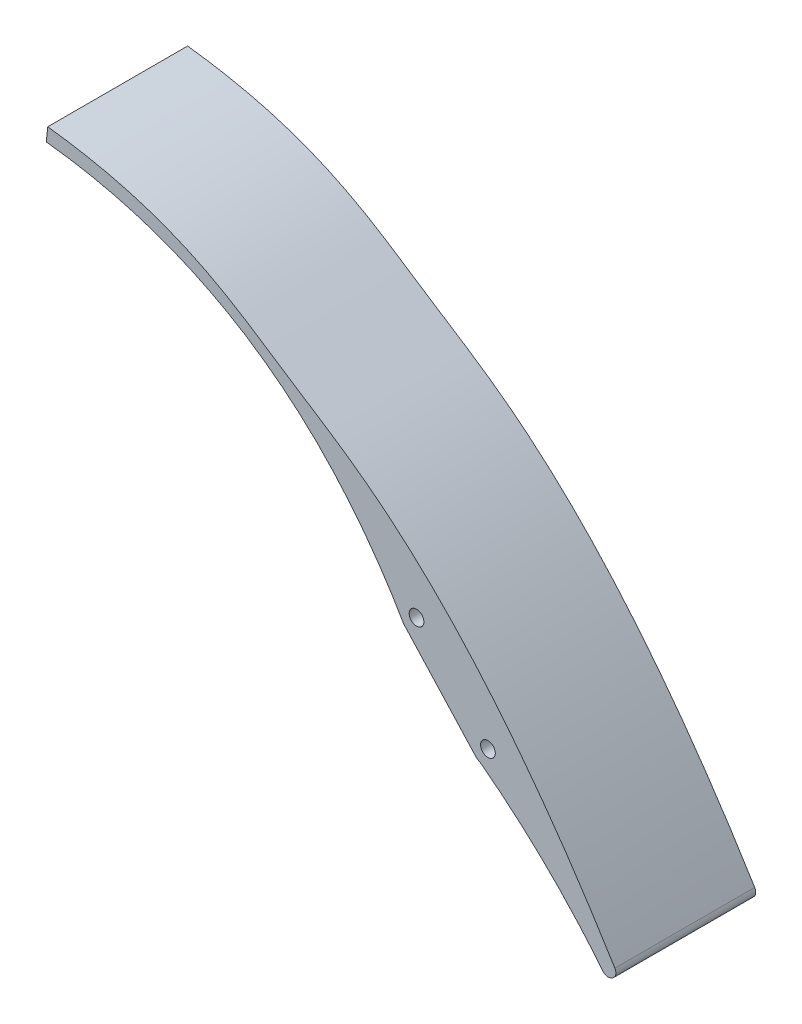
ISO-10303-21;
HEADER;
FILE_DESCRIPTION(('STEP AP214'),'2;1');
FILE_NAME('part.step','',(''),(''),'','','');
FILE_SCHEMA(('AUTOMOTIVE_DESIGN { 1 0 10303 214 1 1 1 1 }'));
ENDSEC;
DATA;
#1=APPLICATION_CONTEXT('core data for automotive mechanical design processes');
#2=APPLICATION_PROTOCOL_DEFINITION('international standard','automotive_design',2000,#1);
#3=PRODUCT_CONTEXT('',#1,'mechanical');
#4=PRODUCT('Part','Part','',(#3));
#5=PRODUCT_RELATED_PRODUCT_CATEGORY('part','',(#4));
#6=PRODUCT_DEFINITION_FORMATION('','',#4);
#7=PRODUCT_DEFINITION_CONTEXT('part definition',#1,'design');
#8=PRODUCT_DEFINITION('design','',#6,#7);
#9=PRODUCT_DEFINITION_SHAPE('','',#8);
#10=(LENGTH_UNIT() NAMED_UNIT(*) SI_UNIT(.MILLI.,.METRE.));
#11=(NAMED_UNIT(*) PLANE_ANGLE_UNIT() SI_UNIT($,.RADIAN.));
#12=(NAMED_UNIT(*) SI_UNIT($,.STERADIAN.) SOLID_ANGLE_UNIT());
#13=UNCERTAINTY_MEASURE_WITH_UNIT(LENGTH_MEASURE(1.E-05),#10,'distance_accuracy_value','');
#14=(GEOMETRIC_REPRESENTATION_CONTEXT(3) GLOBAL_UNCERTAINTY_ASSIGNED_CONTEXT((#13)) GLOBAL_UNIT_ASSIGNED_CONTEXT((#10,
#11,#12)) REPRESENTATION_CONTEXT('',''));
#15=CARTESIAN_POINT('',(0.,0.,0.));
#16=DIRECTION('',(0.,0.,1.));
#17=DIRECTION('',(1.,0.,0.));
#18=AXIS2_PLACEMENT_3D('',#15,#16,#17);
#19=CARTESIAN_POINT('',(130.724364715607,-46.4528662024338,40.));
#20=DIRECTION('',(0.,0.,-1.));
#21=DIRECTION('',(-1.,0.,0.));
#22=AXIS2_PLACEMENT_3D('',#19,#20,#21);
#23=CYLINDRICAL_SURFACE('',#22,1.70000000000007);
#24=CARTESIAN_POINT('',(130.724364715607,-46.4528662024338,34.3));
#25=DIRECTION('',(0.,0.,1.));
#26=DIRECTION('',(1.,0.,0.));
#27=AXIS2_PLACEMENT_3D('',#24,#25,#26);
#28=CIRCLE('',#27,1.70000000000007);
#29=CARTESIAN_POINT('',(132.424364715607,-46.4528662024338,34.3));
#30=VERTEX_POINT('',#29);
#31=EDGE_CURVE('E157',#30,#30,#28,.T.);
#32=ORIENTED_EDGE('',*,*,#31,.T.);
#33=EDGE_LOOP('',(#32));
#34=FACE_BOUND('',#33,.T.);
#35=CARTESIAN_POINT('',(130.724364715607,-46.4528662024338,5.7));
#36=DIRECTION('',(0.,0.,-1.));
#37=DIRECTION('',(-1.,0.,0.));
#38=AXIS2_PLACEMENT_3D('',#35,#36,#37);
#39=CIRCLE('',#38,1.70000000000007);
#40=CARTESIAN_POINT('',(129.024364715607,-46.4528662024338,5.7));
#41=VERTEX_POINT('',#40);
#42=EDGE_CURVE('E45',#41,#41,#39,.T.);
#43=ORIENTED_EDGE('',*,*,#42,.T.);
#44=EDGE_LOOP('',(#43));
#45=FACE_BOUND('',#44,.T.);
#46=ADVANCED_FACE('F41',(#34,#45),#23,.F.);
#47=CARTESIAN_POINT('',(110.297796690224,-24.1245872252414,40.));
#48=DIRECTION('',(0.,0.,-1.));
#49=DIRECTION('',(-1.,0.,0.));
#50=AXIS2_PLACEMENT_3D('',#47,#48,#49);
#51=CYLINDRICAL_SURFACE('',#50,1.7);
#52=CARTESIAN_POINT('',(110.297796690224,-24.1245872252414,34.3));
#53=DIRECTION('',(0.,0.,1.));
#54=DIRECTION('',(1.,0.,0.));
#55=AXIS2_PLACEMENT_3D('',#52,#53,#54);
#56=CIRCLE('',#55,1.7);
#57=CARTESIAN_POINT('',(111.997796690224,-24.1245872252414,34.3));
#58=VERTEX_POINT('',#57);
#59=EDGE_CURVE('E154',#58,#58,#56,.T.);
#60=ORIENTED_EDGE('',*,*,#59,.T.);
#61=EDGE_LOOP('',(#60));
#62=FACE_BOUND('',#61,.T.);
#63=CARTESIAN_POINT('',(110.297796690224,-24.1245872252414,5.7));
#64=DIRECTION('',(0.,0.,-1.));
#65=DIRECTION('',(-1.,0.,0.));
#66=AXIS2_PLACEMENT_3D('',#63,#64,#65);
#67=CIRCLE('',#66,1.7);
#68=CARTESIAN_POINT('',(108.597796690224,-24.1245872252414,5.7));
#69=VERTEX_POINT('',#68);
#70=EDGE_CURVE('E160',#69,#69,#67,.T.);
#71=ORIENTED_EDGE('',*,*,#70,.T.);
#72=EDGE_LOOP('',(#71));
#73=FACE_BOUND('',#72,.T.);
#74=ADVANCED_FACE('F217',(#62,#73),#51,.F.);
#75=CARTESIAN_POINT('',(70.6758975324158,19.0548698246532,40.));
#76=DIRECTION('',(0.,0.,1.));
#77=DIRECTION('',(1.,0.,0.));
#78=AXIS2_PLACEMENT_3D('',#75,#76,#77);
#79=PLANE('',#78);
#80=CARTESIAN_POINT('',(110.297796690224,-24.1245872252414,40.));
#81=DIRECTION('',(0.,0.,1.));
#82=DIRECTION('',(1.,0.,0.));
#83=AXIS2_PLACEMENT_3D('',#80,#81,#82);
#84=CIRCLE('',#83,2.1);
#85=CARTESIAN_POINT('',(112.397796690224,-24.1245872252414,40.));
#86=VERTEX_POINT('',#85);
#87=EDGE_CURVE('E183',#86,#86,#84,.T.);
#88=ORIENTED_EDGE('',*,*,#87,.F.);
#89=EDGE_LOOP('',(#88));
#90=FACE_BOUND('',#89,.T.);
#91=CARTESIAN_POINT('',(130.724364715607,-46.4528662024338,40.));
#92=DIRECTION('',(0.,0.,1.));
#93=DIRECTION('',(1.,0.,0.));
#94=AXIS2_PLACEMENT_3D('',#91,#92,#93);
#95=CIRCLE('',#94,2.09999999999999);
#96=CARTESIAN_POINT('',(132.824364715607,-46.4528662024338,40.));
#97=VERTEX_POINT('',#96);
#98=EDGE_CURVE('E186',#97,#97,#95,.T.);
#99=ORIENTED_EDGE('',*,*,#98,.F.);
#100=EDGE_LOOP('',(#99));
#101=FACE_BOUND('',#100,.T.);
#102=CARTESIAN_POINT('',(128.743429567469,-51.0437153547012,40.));
#103=CARTESIAN_POINT('',(148.96843839334,-66.4337260488509,40.));
#104=CARTESIAN_POINT('',(164.635114100417,-86.3416627578946,40.));
#105=B_SPLINE_CURVE_WITH_KNOTS('',2,(#102,#103,#104),.UNSPECIFIED.,.F.,.F.,(3,3),(0.,1.),.UNSPECIFIED.);
#106=CARTESIAN_POINT('',(128.743429567469,-51.0437153547012,40.));
#107=VERTEX_POINT('',#106);
#108=CARTESIAN_POINT('',(163.560215272833,-84.9877828397496,40.));
#109=VERTEX_POINT('',#108);
#110=EDGE_CURVE('E240',#107,#109,#105,.T.);
#111=ORIENTED_EDGE('',*,*,#110,.T.);
#112=CARTESIAN_POINT('',(165.121208388349,-83.7374626834253,40.));
#113=DIRECTION('',(0.,0.,1.));
#114=DIRECTION('',(1.,0.,0.));
#115=AXIS2_PLACEMENT_3D('',#112,#113,#114);
#116=CIRCLE('',#115,2.);
#117=CARTESIAN_POINT('',(166.133452705259,-85.4623862883665,40.));
#118=VERTEX_POINT('',#117);
#119=EDGE_CURVE('E50',#109,#118,#116,.T.);
#120=ORIENTED_EDGE('',*,*,#119,.T.);
#121=DIRECTION('',(0.862461802470616,0.506122158454989,0.));
#122=VECTOR('',#121,1.);
#123=CARTESIAN_POINT('',(164.635114100417,-86.3416627578946,40.));
#124=LINE('',#123,#122);
#125=CARTESIAN_POINT('',(166.331834159062,-85.3459692490161,40.));
#126=VERTEX_POINT('',#125);
#127=EDGE_CURVE('E246',#118,#126,#124,.T.);
#128=ORIENTED_EDGE('',*,*,#127,.T.);
#129=CARTESIAN_POINT('',(165.319589842152,-83.6210456440749,40.));
#130=DIRECTION('',(0.,0.,1.));
#131=DIRECTION('',(1.,0.,0.));
#132=AXIS2_PLACEMENT_3D('',#129,#130,#131);
#133=CIRCLE('',#132,2.);
#134=CARTESIAN_POINT('',(167.026129233461,-82.5781059018509,40.));
#135=VERTEX_POINT('',#134);
#136=EDGE_CURVE('E58',#126,#135,#133,.T.);
#137=ORIENTED_EDGE('',*,*,#136,.T.);
#138=CARTESIAN_POINT('',(168.084692517356,-84.3173318609907,40.));
#139=CARTESIAN_POINT('',(129.85642190733,-21.2507757173742,40.));
#140=CARTESIAN_POINT('',(92.1542600001913,5.4064902077778,40.));
#141=CARTESIAN_POINT('',(60.0163151433192,25.5499092680861,40.));
#142=CARTESIAN_POINT('',(41.684065008171,40.2044709795662,40.));
#143=CARTESIAN_POINT('',(4.82315625797057,44.7407774151411,40.));
#144=B_SPLINE_CURVE_WITH_KNOTS('',3,(#138,#139,#140,#141,#142,#143),.UNSPECIFIED.,.F.,.F.,(4,1,
1,4),(0.,0.363944680239571,0.463944680239571,1.),.UNSPECIFIED.);
#145=CARTESIAN_POINT('',(4.82315625797057,44.7407774151411,40.));
#146=VERTEX_POINT('',#145);
#147=EDGE_CURVE('E114',#135,#146,#144,.T.);
#148=ORIENTED_EDGE('',*,*,#147,.T.);
#149=DIRECTION('',(-0.107181250177124,-0.994239498114247,0.));
#150=VECTOR('',#149,1.);
#151=CARTESIAN_POINT('',(4.82315625797057,44.7407774151411,40.));
#152=LINE('',#151,#150);
#153=CARTESIAN_POINT('',(4.39443125726207,40.7638194226841,40.));
#154=VERTEX_POINT('',#153);
#155=EDGE_CURVE('E117',#146,#154,#152,.T.);
#156=ORIENTED_EDGE('',*,*,#155,.T.);
#157=CARTESIAN_POINT('',(4.39443125726207,40.7638194226841,40.));
#158=CARTESIAN_POINT('',(71.4407283146677,33.3323945022629,40.));
#159=CARTESIAN_POINT('',(106.608651808152,-27.4995257489901,40.));
#160=B_SPLINE_CURVE_WITH_KNOTS('',2,(#157,#158,#159),.UNSPECIFIED.,.F.,.F.,(3,3),(0.,1.),.UNSPECIFIED.);
#161=CARTESIAN_POINT('',(106.608651808152,-27.4995257489901,40.));
#162=VERTEX_POINT('',#161);
#163=EDGE_CURVE('E131',#154,#162,#160,.T.);
#164=ORIENTED_EDGE('',*,*,#163,.T.);
#165=DIRECTION('',(0.674987704749734,-0.737828976414376,0.));
#166=VECTOR('',#165,1.);
#167=CARTESIAN_POINT('',(106.608651808152,-27.4995257489901,40.));
#168=LINE('',#167,#166);
#169=CARTESIAN_POINT('',(127.035219833535,-49.8278047261825,40.));
#170=VERTEX_POINT('',#169);
#171=EDGE_CURVE('E293',#162,#170,#168,.T.);
#172=ORIENTED_EDGE('',*,*,#171,.T.);
#173=CARTESIAN_POINT('',(130.724364715607,-46.4528662024338,40.));
#174=DIRECTION('',(0.,0.,1.));
#175=DIRECTION('',(1.,0.,0.));
#176=AXIS2_PLACEMENT_3D('',#173,#174,#175);
#177=CIRCLE('',#176,5.00000000000002);
#178=EDGE_CURVE('E247',#170,#107,#177,.T.);
#179=ORIENTED_EDGE('',*,*,#178,.T.);
#180=EDGE_LOOP('',(#111,#120,#128,#137,#148,#156,#164,#172,#179));
#181=FACE_BOUND('',#180,.T.);
#182=ADVANCED_FACE('F116',(#90,#101,#181),#79,.T.);
#183=CARTESIAN_POINT('',(70.6758975324158,19.0548698246532,0.));
#184=DIRECTION('',(0.,0.,1.));
#185=DIRECTION('',(1.,0.,0.));
#186=AXIS2_PLACEMENT_3D('',#183,#184,#185);
#187=PLANE('',#186);
#188=CARTESIAN_POINT('',(110.297796690224,-24.1245872252414,0.));
#189=DIRECTION('',(0.,0.,1.));
#190=DIRECTION('',(1.,0.,0.));
#191=AXIS2_PLACEMENT_3D('',#188,#189,#190);
#192=CIRCLE('',#191,2.1);
#193=CARTESIAN_POINT('',(112.397796690224,-24.1245872252414,0.));
#194=VERTEX_POINT('',#193);
#195=EDGE_CURVE('E168',#194,#194,#192,.T.);
#196=ORIENTED_EDGE('',*,*,#195,.T.);
#197=EDGE_LOOP('',(#196));
#198=FACE_BOUND('',#197,.T.);
#199=CARTESIAN_POINT('',(130.724364715607,-46.4528662024338,0.));
#200=DIRECTION('',(0.,0.,1.));
#201=DIRECTION('',(1.,0.,0.));
#202=AXIS2_PLACEMENT_3D('',#199,#200,#201);
#203=CIRCLE('',#202,2.09999999999999);
#204=CARTESIAN_POINT('',(132.824364715607,-46.4528662024338,0.));
#205=VERTEX_POINT('',#204);
#206=EDGE_CURVE('E178',#205,#205,#203,.T.);
#207=ORIENTED_EDGE('',*,*,#206,.T.);
#208=EDGE_LOOP('',(#207));
#209=FACE_BOUND('',#208,.T.);
#210=DIRECTION('',(0.862461802470616,0.506122158454989,0.));
#211=VECTOR('',#210,1.);
#212=CARTESIAN_POINT('',(164.635114100417,-86.3416627578946,0.));
#213=LINE('',#212,#211);
#214=CARTESIAN_POINT('',(166.133452705259,-85.4623862883665,0.));
#215=VERTEX_POINT('',#214);
#216=CARTESIAN_POINT('',(166.331834159062,-85.3459692490161,0.));
#217=VERTEX_POINT('',#216);
#218=EDGE_CURVE('E122',#215,#217,#213,.T.);
#219=ORIENTED_EDGE('',*,*,#218,.F.);
#220=CARTESIAN_POINT('',(165.121208388349,-83.7374626834253,0.));
#221=DIRECTION('',(0.,0.,1.));
#222=DIRECTION('',(1.,0.,0.));
#223=AXIS2_PLACEMENT_3D('',#220,#221,#222);
#224=CIRCLE('',#223,2.);
#225=CARTESIAN_POINT('',(163.560215272833,-84.9877828397496,0.));
#226=VERTEX_POINT('',#225);
#227=EDGE_CURVE('E149',#215,#226,#224,.F.);
#228=ORIENTED_EDGE('',*,*,#227,.T.);
#229=CARTESIAN_POINT('',(128.743429567469,-51.0437153547012,0.));
#230=CARTESIAN_POINT('',(148.96843839334,-66.4337260488509,0.));
#231=CARTESIAN_POINT('',(164.635114100417,-86.3416627578946,0.));
#232=B_SPLINE_CURVE_WITH_KNOTS('',2,(#229,#230,#231),.UNSPECIFIED.,.F.,.F.,(3,3),(0.,1.),.UNSPECIFIED.);
#233=CARTESIAN_POINT('',(128.743429567469,-51.0437153547012,0.));
#234=VERTEX_POINT('',#233);
#235=EDGE_CURVE('E273',#234,#226,#232,.T.);
#236=ORIENTED_EDGE('',*,*,#235,.F.);
#237=CARTESIAN_POINT('',(130.724364715607,-46.4528662024338,0.));
#238=DIRECTION('',(0.,0.,1.));
#239=DIRECTION('',(1.,0.,0.));
#240=AXIS2_PLACEMENT_3D('',#237,#238,#239);
#241=CIRCLE('',#240,5.00000000000002);
#242=CARTESIAN_POINT('',(127.035219833535,-49.8278047261825,0.));
#243=VERTEX_POINT('',#242);
#244=EDGE_CURVE('E271',#243,#234,#241,.T.);
#245=ORIENTED_EDGE('',*,*,#244,.F.);
#246=DIRECTION('',(0.674987704749734,-0.737828976414376,0.));
#247=VECTOR('',#246,1.);
#248=CARTESIAN_POINT('',(106.608651808152,-27.4995257489901,0.));
#249=LINE('',#248,#247);
#250=CARTESIAN_POINT('',(106.608651808152,-27.4995257489901,0.));
#251=VERTEX_POINT('',#250);
#252=EDGE_CURVE('E266',#251,#243,#249,.T.);
#253=ORIENTED_EDGE('',*,*,#252,.F.);
#254=CARTESIAN_POINT('',(4.39443125726207,40.7638194226841,0.));
#255=CARTESIAN_POINT('',(71.4407283146677,33.3323945022629,0.));
#256=CARTESIAN_POINT('',(106.608651808152,-27.4995257489901,0.));
#257=B_SPLINE_CURVE_WITH_KNOTS('',2,(#254,#255,#256),.UNSPECIFIED.,.F.,.F.,(3,3),(0.,1.),.UNSPECIFIED.);
#258=CARTESIAN_POINT('',(4.39443125726207,40.7638194226841,0.));
#259=VERTEX_POINT('',#258);
#260=EDGE_CURVE('E262',#259,#251,#257,.T.);
#261=ORIENTED_EDGE('',*,*,#260,.F.);
#262=DIRECTION('',(-0.107181250177124,-0.994239498114247,0.));
#263=VECTOR('',#262,1.);
#264=CARTESIAN_POINT('',(4.82315625797057,44.7407774151411,0.));
#265=LINE('',#264,#263);
#266=CARTESIAN_POINT('',(4.82315625797057,44.7407774151411,0.));
#267=VERTEX_POINT('',#266);
#268=EDGE_CURVE('E257',#267,#259,#265,.T.);
#269=ORIENTED_EDGE('',*,*,#268,.F.);
#270=CARTESIAN_POINT('',(168.084692517356,-84.3173318609907,0.));
#271=CARTESIAN_POINT('',(129.85642190733,-21.2507757173742,0.));
#272=CARTESIAN_POINT('',(92.1542600001913,5.4064902077778,0.));
#273=CARTESIAN_POINT('',(60.0163151433192,25.5499092680861,0.));
#274=CARTESIAN_POINT('',(41.684065008171,40.2044709795662,0.));
#275=CARTESIAN_POINT('',(4.82315625797057,44.7407774151411,0.));
#276=B_SPLINE_CURVE_WITH_KNOTS('',3,(#270,#271,#272,#273,#274,#275),.UNSPECIFIED.,.F.,.F.,(4,1,
1,4),(0.,0.363944680239571,0.463944680239571,1.),.UNSPECIFIED.);
#277=CARTESIAN_POINT('',(167.026129233461,-82.5781059018509,0.));
#278=VERTEX_POINT('',#277);
#279=EDGE_CURVE('E135',#278,#267,#276,.T.);
#280=ORIENTED_EDGE('',*,*,#279,.F.);
#281=CARTESIAN_POINT('',(165.319589842152,-83.6210456440749,0.));
#282=DIRECTION('',(0.,0.,1.));
#283=DIRECTION('',(1.,0.,0.));
#284=AXIS2_PLACEMENT_3D('',#281,#282,#283);
#285=CIRCLE('',#284,2.);
#286=EDGE_CURVE('E147',#278,#217,#285,.F.);
#287=ORIENTED_EDGE('',*,*,#286,.T.);
#288=EDGE_LOOP('',(#219,#228,#236,#245,#253,#261,#269,#280,#287));
#289=FACE_BOUND('',#288,.T.);
#290=ADVANCED_FACE('F200',(#198,#209,#289),#187,.F.);
#291=DIRECTION('',(0.,0.,-1.));
#292=VECTOR('',#291,1.);
#293=SURFACE_OF_LINEAR_EXTRUSION('',#144,#292);
#294=ORIENTED_EDGE('',*,*,#147,.F.);
#295=DIRECTION('',(0.,0.,-1.));
#296=VECTOR('',#295,1.);
#297=CARTESIAN_POINT('',(167.026129233461,-82.5781059018506,40.));
#298=LINE('',#297,#296);
#299=EDGE_CURVE('E11',#135,#278,#298,.T.);
#300=ORIENTED_EDGE('',*,*,#299,.T.);
#301=ORIENTED_EDGE('',*,*,#279,.T.);
#302=DIRECTION('',(0.,0.,-1.));
#303=VECTOR('',#302,1.);
#304=CARTESIAN_POINT('',(4.82315625797057,44.7407774151411,40.));
#305=LINE('',#304,#303);
#306=EDGE_CURVE('E127',#146,#267,#305,.T.);
#307=ORIENTED_EDGE('',*,*,#306,.F.);
#308=EDGE_LOOP('',(#294,#300,#301,#307));
#309=FACE_BOUND('',#308,.T.);
#310=ADVANCED_FACE('F133',(#309),#293,.F.);
#311=CARTESIAN_POINT('',(4.82315625797057,44.7407774151411,40.));
#312=DIRECTION('',(0.994239498114246,-0.107181250177124,0.));
#313=DIRECTION('',(0.107181250177124,0.994239498114247,0.));
#314=AXIS2_PLACEMENT_3D('',#311,#312,#313);
#315=PLANE('',#314);
#316=ORIENTED_EDGE('',*,*,#268,.T.);
#317=DIRECTION('',(0.,0.,-1.));
#318=VECTOR('',#317,1.);
#319=CARTESIAN_POINT('',(4.39443125726207,40.7638194226841,40.));
#320=LINE('',#319,#318);
#321=EDGE_CURVE('E129',#154,#259,#320,.T.);
#322=ORIENTED_EDGE('',*,*,#321,.F.);
#323=ORIENTED_EDGE('',*,*,#155,.F.);
#324=ORIENTED_EDGE('',*,*,#306,.T.);
#325=EDGE_LOOP('',(#316,#322,#323,#324));
#326=FACE_BOUND('',#325,.T.);
#327=ADVANCED_FACE('F126',(#326),#315,.F.);
#328=DIRECTION('',(0.,0.,-1.));
#329=VECTOR('',#328,1.);
#330=SURFACE_OF_LINEAR_EXTRUSION('',#160,#329);
#331=ORIENTED_EDGE('',*,*,#260,.T.);
#332=DIRECTION('',(0.,0.,-1.));
#333=VECTOR('',#332,1.);
#334=CARTESIAN_POINT('',(106.608651808152,-27.4995257489901,40.));
#335=LINE('',#334,#333);
#336=EDGE_CURVE('E141',#162,#251,#335,.T.);
#337=ORIENTED_EDGE('',*,*,#336,.F.);
#338=ORIENTED_EDGE('',*,*,#163,.F.);
#339=ORIENTED_EDGE('',*,*,#321,.T.);
#340=EDGE_LOOP('',(#331,#337,#338,#339));
#341=FACE_BOUND('',#340,.T.);
#342=ADVANCED_FACE('F306',(#341),#330,.F.);
#343=CARTESIAN_POINT('',(106.608651808152,-27.4995257489901,40.));
#344=DIRECTION('',(0.737828976414376,0.674987704749734,0.));
#345=DIRECTION('',(-0.674987704749734,0.737828976414376,0.));
#346=AXIS2_PLACEMENT_3D('',#343,#344,#345);
#347=PLANE('',#346);
#348=ORIENTED_EDGE('',*,*,#252,.T.);
#349=DIRECTION('',(0.,0.,-1.));
#350=VECTOR('',#349,1.);
#351=CARTESIAN_POINT('',(127.035219833535,-49.8278047261825,40.));
#352=LINE('',#351,#350);
#353=EDGE_CURVE('E284',#170,#243,#352,.T.);
#354=ORIENTED_EDGE('',*,*,#353,.F.);
#355=ORIENTED_EDGE('',*,*,#171,.F.);
#356=ORIENTED_EDGE('',*,*,#336,.T.);
#357=EDGE_LOOP('',(#348,#354,#355,#356));
#358=FACE_BOUND('',#357,.T.);
#359=ADVANCED_FACE('F291',(#358),#347,.F.);
#360=CARTESIAN_POINT('',(130.724364715607,-46.4528662024338,40.));
#361=DIRECTION('',(0.,0.,-1.));
#362=DIRECTION('',(-1.,0.,0.));
#363=AXIS2_PLACEMENT_3D('',#360,#361,#362);
#364=CYLINDRICAL_SURFACE('',#363,5.00000000000002);
#365=ORIENTED_EDGE('',*,*,#244,.T.);
#366=DIRECTION('',(0.,0.,-1.));
#367=VECTOR('',#366,1.);
#368=CARTESIAN_POINT('',(128.743429567469,-51.0437153547012,40.));
#369=LINE('',#368,#367);
#370=EDGE_CURVE('E253',#107,#234,#369,.T.);
#371=ORIENTED_EDGE('',*,*,#370,.F.);
#372=ORIENTED_EDGE('',*,*,#178,.F.);
#373=ORIENTED_EDGE('',*,*,#353,.T.);
#374=EDGE_LOOP('',(#365,#371,#372,#373));
#375=FACE_BOUND('',#374,.T.);
#376=ADVANCED_FACE('F238',(#375),#364,.T.);
#377=DIRECTION('',(0.,0.,-1.));
#378=VECTOR('',#377,1.);
#379=SURFACE_OF_LINEAR_EXTRUSION('',#105,#378);
#380=ORIENTED_EDGE('',*,*,#235,.T.);
#381=DIRECTION('',(0.,0.,-1.));
#382=VECTOR('',#381,1.);
#383=CARTESIAN_POINT('',(163.560215272833,-84.9877828397496,0.));
#384=LINE('',#383,#382);
#385=EDGE_CURVE('E66',#226,#109,#384,.F.);
#386=ORIENTED_EDGE('',*,*,#385,.T.);
#387=ORIENTED_EDGE('',*,*,#110,.F.);
#388=ORIENTED_EDGE('',*,*,#370,.T.);
#389=EDGE_LOOP('',(#380,#386,#387,#388));
#390=FACE_BOUND('',#389,.T.);
#391=ADVANCED_FACE('F212',(#390),#379,.F.);
#392=CARTESIAN_POINT('',(164.635114100417,-86.3416627578946,40.));
#393=DIRECTION('',(-0.506122158454989,0.862461802470616,0.));
#394=DIRECTION('',(-0.862461802470616,-0.506122158454989,0.));
#395=AXIS2_PLACEMENT_3D('',#392,#393,#394);
#396=PLANE('',#395);
#397=ORIENTED_EDGE('',*,*,#127,.F.);
#398=DIRECTION('',(0.,0.,-1.));
#399=VECTOR('',#398,1.);
#400=CARTESIAN_POINT('',(166.133452705259,-85.4623862883665,40.));
#401=LINE('',#400,#399);
#402=EDGE_CURVE('E139',#118,#215,#401,.T.);
#403=ORIENTED_EDGE('',*,*,#402,.T.);
#404=ORIENTED_EDGE('',*,*,#218,.T.);
#405=DIRECTION('',(0.,0.,-1.));
#406=VECTOR('',#405,1.);
#407=CARTESIAN_POINT('',(166.331834159062,-85.3459692490161,40.));
#408=LINE('',#407,#406);
#409=EDGE_CURVE('E137',#217,#126,#408,.F.);
#410=ORIENTED_EDGE('',*,*,#409,.T.);
#411=EDGE_LOOP('',(#397,#403,#404,#410));
#412=FACE_BOUND('',#411,.T.);
#413=ADVANCED_FACE('F204',(#412),#396,.F.);
#414=CARTESIAN_POINT('',(165.121208388349,-83.7374626834253,20.));
#415=DIRECTION('',(0.,0.,-1.));
#416=DIRECTION('',(-1.,0.,0.));
#417=AXIS2_PLACEMENT_3D('',#414,#415,#416);
#418=CYLINDRICAL_SURFACE('',#417,2.);
#419=ORIENTED_EDGE('',*,*,#119,.F.);
#420=ORIENTED_EDGE('',*,*,#385,.F.);
#421=ORIENTED_EDGE('',*,*,#227,.F.);
#422=ORIENTED_EDGE('',*,*,#402,.F.);
#423=EDGE_LOOP('',(#419,#420,#421,#422));
#424=FACE_BOUND('',#423,.T.);
#425=ADVANCED_FACE('F202',(#424),#418,.T.);
#426=CARTESIAN_POINT('',(165.319589842152,-83.6210456440749,20.));
#427=DIRECTION('',(0.,0.,-1.));
#428=DIRECTION('',(-1.,0.,0.));
#429=AXIS2_PLACEMENT_3D('',#426,#427,#428);
#430=CYLINDRICAL_SURFACE('',#429,2.);
#431=ORIENTED_EDGE('',*,*,#136,.F.);
#432=ORIENTED_EDGE('',*,*,#409,.F.);
#433=ORIENTED_EDGE('',*,*,#286,.F.);
#434=ORIENTED_EDGE('',*,*,#299,.F.);
#435=EDGE_LOOP('',(#431,#432,#433,#434));
#436=FACE_BOUND('',#435,.T.);
#437=ADVANCED_FACE('F43',(#436),#430,.T.);
#438=CARTESIAN_POINT('',(110.297796690224,-24.1245872252414,34.3));
#439=DIRECTION('',(0.,0.,1.));
#440=DIRECTION('',(1.,0.,0.));
#441=AXIS2_PLACEMENT_3D('',#438,#439,#440);
#442=CYLINDRICAL_SURFACE('',#441,2.1);
#443=CARTESIAN_POINT('',(110.297796690224,-24.1245872252414,34.3));
#444=DIRECTION('',(0.,0.,1.));
#445=DIRECTION('',(1.,0.,0.));
#446=AXIS2_PLACEMENT_3D('',#443,#444,#445);
#447=CIRCLE('',#446,2.1);
#448=CARTESIAN_POINT('',(112.397796690224,-24.1245872252414,34.3));
#449=VERTEX_POINT('',#448);
#450=EDGE_CURVE('E158',#449,#449,#447,.T.);
#451=ORIENTED_EDGE('',*,*,#450,.F.);
#452=EDGE_LOOP('',(#451));
#453=FACE_BOUND('',#452,.T.);
#454=ORIENTED_EDGE('',*,*,#87,.T.);
#455=EDGE_LOOP('',(#454));
#456=FACE_BOUND('',#455,.T.);
#457=ADVANCED_FACE('F210',(#453,#456),#442,.F.);
#458=CARTESIAN_POINT('',(110.297796690224,-24.1245872252414,34.3));
#459=DIRECTION('',(0.,0.,1.));
#460=DIRECTION('',(1.,0.,0.));
#461=AXIS2_PLACEMENT_3D('',#458,#459,#460);
#462=PLANE('',#461);
#463=ORIENTED_EDGE('',*,*,#59,.F.);
#464=EDGE_LOOP('',(#463));
#465=FACE_BOUND('',#464,.T.);
#466=ORIENTED_EDGE('',*,*,#450,.T.);
#467=EDGE_LOOP('',(#466));
#468=FACE_BOUND('',#467,.T.);
#469=ADVANCED_FACE('F357',(#465,#468),#462,.T.);
#470=CARTESIAN_POINT('',(130.724364715607,-46.4528662024338,34.3));
#471=DIRECTION('',(0.,0.,1.));
#472=DIRECTION('',(1.,0.,0.));
#473=AXIS2_PLACEMENT_3D('',#470,#471,#472);
#474=CYLINDRICAL_SURFACE('',#473,2.09999999999999);
#475=CARTESIAN_POINT('',(130.724364715607,-46.4528662024338,34.3));
#476=DIRECTION('',(0.,0.,1.));
#477=DIRECTION('',(1.,0.,0.));
#478=AXIS2_PLACEMENT_3D('',#475,#476,#477);
#479=CIRCLE('',#478,2.09999999999999);
#480=CARTESIAN_POINT('',(132.824364715607,-46.4528662024338,34.3));
#481=VERTEX_POINT('',#480);
#482=EDGE_CURVE('E166',#481,#481,#479,.T.);
#483=ORIENTED_EDGE('',*,*,#482,.F.);
#484=EDGE_LOOP('',(#483));
#485=FACE_BOUND('',#484,.T.);
#486=ORIENTED_EDGE('',*,*,#98,.T.);
#487=EDGE_LOOP('',(#486));
#488=FACE_BOUND('',#487,.T.);
#489=ADVANCED_FACE('F367',(#485,#488),#474,.F.);
#490=CARTESIAN_POINT('',(130.724364715607,-46.4528662024338,34.3));
#491=DIRECTION('',(0.,0.,1.));
#492=DIRECTION('',(1.,0.,0.));
#493=AXIS2_PLACEMENT_3D('',#490,#491,#492);
#494=PLANE('',#493);
#495=ORIENTED_EDGE('',*,*,#31,.F.);
#496=EDGE_LOOP('',(#495));
#497=FACE_BOUND('',#496,.T.);
#498=ORIENTED_EDGE('',*,*,#482,.T.);
#499=EDGE_LOOP('',(#498));
#500=FACE_BOUND('',#499,.T.);
#501=ADVANCED_FACE('F377',(#497,#500),#494,.T.);
#502=CARTESIAN_POINT('',(130.724364715607,-46.4528662024338,5.7));
#503=DIRECTION('',(0.,0.,-1.));
#504=DIRECTION('',(-1.,0.,0.));
#505=AXIS2_PLACEMENT_3D('',#502,#503,#504);
#506=CYLINDRICAL_SURFACE('',#505,2.09999999999999);
#507=CARTESIAN_POINT('',(130.724364715607,-46.4528662024338,5.7));
#508=DIRECTION('',(0.,0.,1.));
#509=DIRECTION('',(1.,0.,0.));
#510=AXIS2_PLACEMENT_3D('',#507,#508,#509);
#511=CIRCLE('',#510,2.09999999999999);
#512=CARTESIAN_POINT('',(132.824364715607,-46.4528662024338,5.7));
#513=VERTEX_POINT('',#512);
#514=EDGE_CURVE('E173',#513,#513,#511,.T.);
#515=ORIENTED_EDGE('',*,*,#514,.T.);
#516=EDGE_LOOP('',(#515));
#517=FACE_BOUND('',#516,.T.);
#518=ORIENTED_EDGE('',*,*,#206,.F.);
#519=EDGE_LOOP('',(#518));
#520=FACE_BOUND('',#519,.T.);
#521=ADVANCED_FACE('F386',(#517,#520),#506,.F.);
#522=CARTESIAN_POINT('',(130.724364715607,-46.4528662024338,5.7));
#523=DIRECTION('',(0.,0.,-1.));
#524=DIRECTION('',(1.,0.,0.));
#525=AXIS2_PLACEMENT_3D('',#522,#523,#524);
#526=PLANE('',#525);
#527=ORIENTED_EDGE('',*,*,#42,.F.);
#528=EDGE_LOOP('',(#527));
#529=FACE_BOUND('',#528,.T.);
#530=ORIENTED_EDGE('',*,*,#514,.F.);
#531=EDGE_LOOP('',(#530));
#532=FACE_BOUND('',#531,.T.);
#533=ADVANCED_FACE('F405',(#529,#532),#526,.T.);
#534=CARTESIAN_POINT('',(110.297796690224,-24.1245872252414,5.7));
#535=DIRECTION('',(0.,0.,-1.));
#536=DIRECTION('',(-1.,0.,0.));
#537=AXIS2_PLACEMENT_3D('',#534,#535,#536);
#538=CYLINDRICAL_SURFACE('',#537,2.1);
#539=CARTESIAN_POINT('',(110.297796690224,-24.1245872252414,5.7));
#540=DIRECTION('',(0.,0.,1.));
#541=DIRECTION('',(1.,0.,0.));
#542=AXIS2_PLACEMENT_3D('',#539,#540,#541);
#543=CIRCLE('',#542,2.1);
#544=CARTESIAN_POINT('',(112.397796690224,-24.1245872252414,5.7));
#545=VERTEX_POINT('',#544);
#546=EDGE_CURVE('E162',#545,#545,#543,.T.);
#547=ORIENTED_EDGE('',*,*,#546,.T.);
#548=EDGE_LOOP('',(#547));
#549=FACE_BOUND('',#548,.T.);
#550=ORIENTED_EDGE('',*,*,#195,.F.);
#551=EDGE_LOOP('',(#550));
#552=FACE_BOUND('',#551,.T.);
#553=ADVANCED_FACE('F415',(#549,#552),#538,.F.);
#554=CARTESIAN_POINT('',(110.297796690224,-24.1245872252414,5.7));
#555=DIRECTION('',(0.,0.,-1.));
#556=DIRECTION('',(1.,0.,0.));
#557=AXIS2_PLACEMENT_3D('',#554,#555,#556);
#558=PLANE('',#557);
#559=ORIENTED_EDGE('',*,*,#70,.F.);
#560=EDGE_LOOP('',(#559));
#561=FACE_BOUND('',#560,.T.);
#562=ORIENTED_EDGE('',*,*,#546,.F.);
#563=EDGE_LOOP('',(#562));
#564=FACE_BOUND('',#563,.T.);
#565=ADVANCED_FACE('F425',(#561,#564),#558,.T.);
#566=CLOSED_SHELL('',(#46,#74,#182,#290,#310,#327,#342,#359,#376,#391,#413,#425,#437,#457,#469,
#489,#501,#521,#533,#553,#565));
#567=MANIFOLD_SOLID_BREP('B2',#566);
#568=ADVANCED_BREP_SHAPE_REPRESENTATION('',(#18,#567),#14);
#569=SHAPE_DEFINITION_REPRESENTATION(#9,#568);
ENDSEC;
END-ISO-10303-21;
